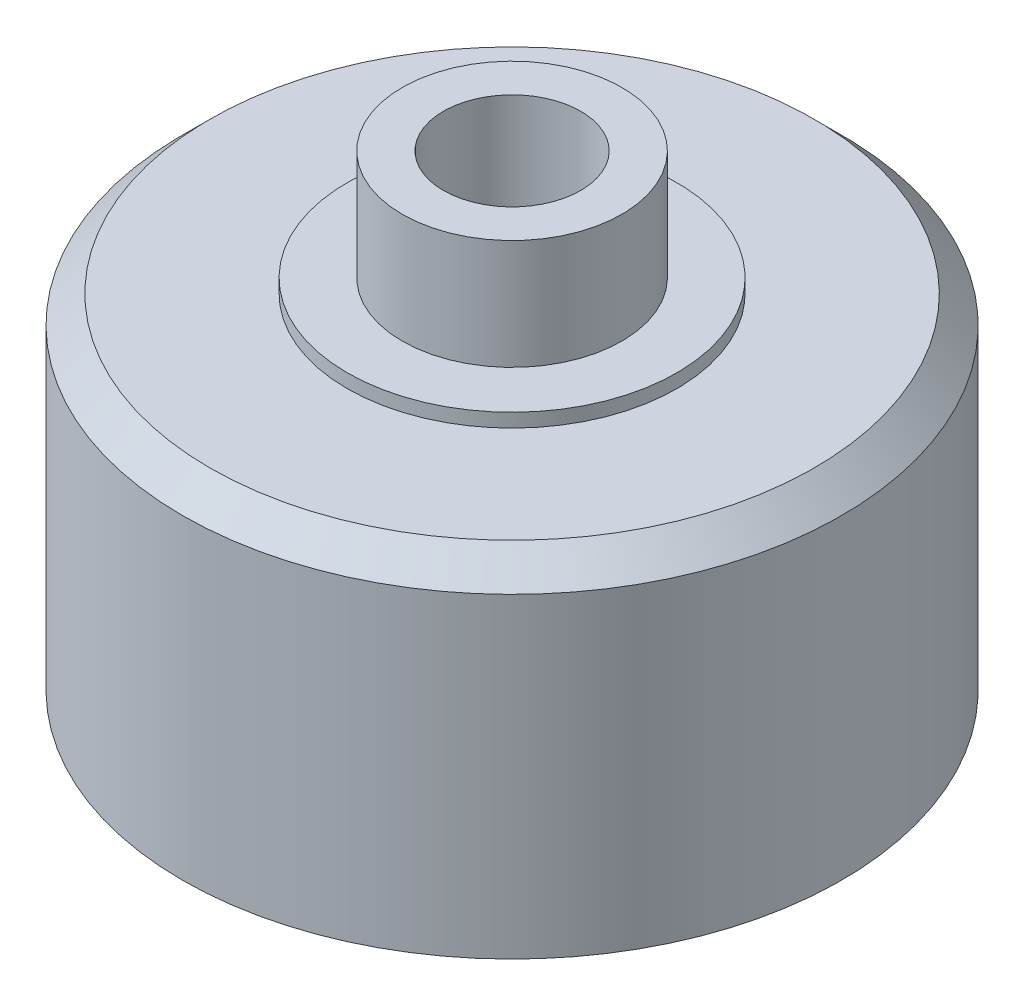
ISO-10303-21;
HEADER;
FILE_DESCRIPTION(('STEP AP214'),'2;1');
FILE_NAME('part.step','',(''),(''),'','','');
FILE_SCHEMA(('AUTOMOTIVE_DESIGN { 1 0 10303 214 1 1 1 1 }'));
ENDSEC;
DATA;
#1=APPLICATION_CONTEXT('core data for automotive mechanical design processes');
#2=APPLICATION_PROTOCOL_DEFINITION('international standard','automotive_design',2000,#1);
#3=PRODUCT_CONTEXT('',#1,'mechanical');
#4=PRODUCT('Part','Part','',(#3));
#5=PRODUCT_RELATED_PRODUCT_CATEGORY('part','',(#4));
#6=PRODUCT_DEFINITION_FORMATION('','',#4);
#7=PRODUCT_DEFINITION_CONTEXT('part definition',#1,'design');
#8=PRODUCT_DEFINITION('design','',#6,#7);
#9=PRODUCT_DEFINITION_SHAPE('','',#8);
#10=(LENGTH_UNIT() NAMED_UNIT(*) SI_UNIT(.MILLI.,.METRE.));
#11=(NAMED_UNIT(*) PLANE_ANGLE_UNIT() SI_UNIT($,.RADIAN.));
#12=(NAMED_UNIT(*) SI_UNIT($,.STERADIAN.) SOLID_ANGLE_UNIT());
#13=UNCERTAINTY_MEASURE_WITH_UNIT(LENGTH_MEASURE(1.E-05),#10,'distance_accuracy_value','');
#14=(GEOMETRIC_REPRESENTATION_CONTEXT(3) GLOBAL_UNCERTAINTY_ASSIGNED_CONTEXT((#13)) GLOBAL_UNIT_ASSIGNED_CONTEXT((#10,
#11,#12)) REPRESENTATION_CONTEXT('',''));
#15=CARTESIAN_POINT('',(0.,0.,0.));
#16=DIRECTION('',(0.,0.,1.));
#17=DIRECTION('',(1.,0.,0.));
#18=AXIS2_PLACEMENT_3D('',#15,#16,#17);
#19=CARTESIAN_POINT('',(0.,12.5,0.));
#20=DIRECTION('',(0.,-1.,0.));
#21=DIRECTION('',(0.,0.,-1.));
#22=AXIS2_PLACEMENT_3D('',#19,#20,#21);
#23=CYLINDRICAL_SURFACE('',#22,10.5);
#24=DIRECTION('',(0.,-1.,0.));
#25=VECTOR('',#24,1.);
#26=CARTESIAN_POINT('',(-7.24030204420042,5.5,-7.60447409810483));
#27=LINE('',#26,#25);
#28=CARTESIAN_POINT('',(-7.24030204420042,0.,-7.60447409810483));
#29=VERTEX_POINT('',#28);
#30=CARTESIAN_POINT('',(-7.24030204420042,11.,-7.60447409810483));
#31=VERTEX_POINT('',#30);
#32=EDGE_CURVE('E53',#29,#31,#27,.F.);
#33=ORIENTED_EDGE('',*,*,#32,.F.);
#34=CARTESIAN_POINT('',(0.,0.,0.));
#35=DIRECTION('',(0.,1.,0.));
#36=DIRECTION('',(0.,0.,1.));
#37=AXIS2_PLACEMENT_3D('',#34,#35,#36);
#38=CIRCLE('',#37,10.5);
#39=CARTESIAN_POINT('',(-2.5,0.,-10.1980390271856));
#40=VERTEX_POINT('',#39);
#41=EDGE_CURVE('E212',#40,#29,#38,.T.);
#42=ORIENTED_EDGE('',*,*,#41,.F.);
#43=DIRECTION('',(0.,-1.,0.));
#44=VECTOR('',#43,1.);
#45=CARTESIAN_POINT('',(-2.5,13.2360679774998,-10.1980390271856));
#46=LINE('',#45,#44);
#47=CARTESIAN_POINT('',(-2.5,11.,-10.1980390271856));
#48=VERTEX_POINT('',#47);
#49=EDGE_CURVE('E272',#48,#40,#46,.T.);
#50=ORIENTED_EDGE('',*,*,#49,.F.);
#51=CARTESIAN_POINT('',(0.,11.,0.));
#52=DIRECTION('',(0.,1.,0.));
#53=DIRECTION('',(0.,0.,1.));
#54=AXIS2_PLACEMENT_3D('',#51,#52,#53);
#55=CIRCLE('',#54,10.5);
#56=EDGE_CURVE('E214',#48,#31,#55,.T.);
#57=ORIENTED_EDGE('',*,*,#56,.T.);
#58=EDGE_LOOP('',(#33,#42,#50,#57));
#59=FACE_BOUND('',#58,.T.);
#60=ADVANCED_FACE('F38',(#59),#23,.F.);
#61=CARTESIAN_POINT('',(9.0913306088608,11.,5.25335204991924));
#62=VERTEX_POINT('',#61);
#63=CARTESIAN_POINT('',(9.0913306088608,11.,-5.25335204991924));
#64=VERTEX_POINT('',#63);
#65=EDGE_CURVE('E432',#62,#64,#55,.T.);
#66=ORIENTED_EDGE('',*,*,#65,.T.);
#67=DIRECTION('',(0.,-1.,0.));
#68=VECTOR('',#67,1.);
#69=CARTESIAN_POINT('',(9.0913306088608,5.5,-5.25335204991924));
#70=LINE('',#69,#68);
#71=CARTESIAN_POINT('',(9.0913306088608,0.,-5.25335204991924));
#72=VERTEX_POINT('',#71);
#73=EDGE_CURVE('E499',#64,#72,#70,.T.);
#74=ORIENTED_EDGE('',*,*,#73,.T.);
#75=CARTESIAN_POINT('',(9.0913306088608,0.,5.25335204991924));
#76=VERTEX_POINT('',#75);
#77=EDGE_CURVE('E233',#76,#72,#38,.T.);
#78=ORIENTED_EDGE('',*,*,#77,.F.);
#79=DIRECTION('',(0.,-1.,0.));
#80=VECTOR('',#79,1.);
#81=CARTESIAN_POINT('',(9.0913306088608,5.5,5.25335204991924));
#82=LINE('',#81,#80);
#83=EDGE_CURVE('E510',#62,#76,#82,.T.);
#84=ORIENTED_EDGE('',*,*,#83,.F.);
#85=EDGE_LOOP('',(#66,#74,#78,#84));
#86=FACE_BOUND('',#85,.T.);
#87=ADVANCED_FACE('F375',(#86),#23,.F.);
#88=CARTESIAN_POINT('',(7.24030204420042,0.,-7.60447409810483));
#89=VERTEX_POINT('',#88);
#90=CARTESIAN_POINT('',(2.5,0.,-10.1980390271856));
#91=VERTEX_POINT('',#90);
#92=EDGE_CURVE('E227',#89,#91,#38,.T.);
#93=ORIENTED_EDGE('',*,*,#92,.F.);
#94=DIRECTION('',(0.,-1.,0.));
#95=VECTOR('',#94,1.);
#96=CARTESIAN_POINT('',(7.24030204420042,5.5,-7.60447409810483));
#97=LINE('',#96,#95);
#98=CARTESIAN_POINT('',(7.24030204420042,11.,-7.60447409810483));
#99=VERTEX_POINT('',#98);
#100=EDGE_CURVE('E497',#89,#99,#97,.F.);
#101=ORIENTED_EDGE('',*,*,#100,.T.);
#102=CARTESIAN_POINT('',(2.5,11.,-10.1980390271856));
#103=VERTEX_POINT('',#102);
#104=EDGE_CURVE('E264',#99,#103,#55,.T.);
#105=ORIENTED_EDGE('',*,*,#104,.T.);
#106=DIRECTION('',(0.,-1.,0.));
#107=VECTOR('',#106,1.);
#108=CARTESIAN_POINT('',(2.5,13.2360679774998,-10.1980390271856));
#109=LINE('',#108,#107);
#110=EDGE_CURVE('E257',#103,#91,#109,.T.);
#111=ORIENTED_EDGE('',*,*,#110,.T.);
#112=EDGE_LOOP('',(#93,#101,#105,#111));
#113=FACE_BOUND('',#112,.T.);
#114=ADVANCED_FACE('F263',(#113),#23,.F.);
#115=DIRECTION('',(0.,-1.,0.));
#116=VECTOR('',#115,1.);
#117=CARTESIAN_POINT('',(7.24030204420042,5.5,7.60447409810483));
#118=LINE('',#117,#116);
#119=CARTESIAN_POINT('',(7.24030204420042,0.,7.60447409810483));
#120=VERTEX_POINT('',#119);
#121=CARTESIAN_POINT('',(7.24030204420042,11.,7.60447409810483));
#122=VERTEX_POINT('',#121);
#123=EDGE_CURVE('E472',#120,#122,#118,.F.);
#124=ORIENTED_EDGE('',*,*,#123,.F.);
#125=CARTESIAN_POINT('',(2.5,0.,10.1980390271856));
#126=VERTEX_POINT('',#125);
#127=EDGE_CURVE('E228',#126,#120,#38,.T.);
#128=ORIENTED_EDGE('',*,*,#127,.F.);
#129=DIRECTION('',(0.,-1.,0.));
#130=VECTOR('',#129,1.);
#131=CARTESIAN_POINT('',(2.5,13.2360679774998,10.1980390271856));
#132=LINE('',#131,#130);
#133=CARTESIAN_POINT('',(2.5,11.,10.1980390271856));
#134=VERTEX_POINT('',#133);
#135=EDGE_CURVE('E292',#134,#126,#132,.T.);
#136=ORIENTED_EDGE('',*,*,#135,.F.);
#137=EDGE_CURVE('E340',#134,#122,#55,.T.);
#138=ORIENTED_EDGE('',*,*,#137,.T.);
#139=EDGE_LOOP('',(#124,#128,#136,#138));
#140=FACE_BOUND('',#139,.T.);
#141=ADVANCED_FACE('F386',(#140),#23,.F.);
#142=DIRECTION('',(0.,-1.,0.));
#143=VECTOR('',#142,1.);
#144=CARTESIAN_POINT('',(-9.0913306088608,5.5,-5.25335204991924));
#145=LINE('',#144,#143);
#146=CARTESIAN_POINT('',(-9.0913306088608,11.,-5.25335204991924));
#147=VERTEX_POINT('',#146);
#148=CARTESIAN_POINT('',(-9.0913306088608,0.,-5.25335204991924));
#149=VERTEX_POINT('',#148);
#150=EDGE_CURVE('E201',#147,#149,#145,.T.);
#151=ORIENTED_EDGE('',*,*,#150,.F.);
#152=CARTESIAN_POINT('',(-9.0913306088608,11.,5.25335204991924));
#153=VERTEX_POINT('',#152);
#154=EDGE_CURVE('E341',#147,#153,#55,.T.);
#155=ORIENTED_EDGE('',*,*,#154,.T.);
#156=DIRECTION('',(0.,-1.,0.));
#157=VECTOR('',#156,1.);
#158=CARTESIAN_POINT('',(-9.0913306088608,5.5,5.25335204991924));
#159=LINE('',#158,#157);
#160=CARTESIAN_POINT('',(-9.0913306088608,0.,5.25335204991924));
#161=VERTEX_POINT('',#160);
#162=EDGE_CURVE('E466',#153,#161,#159,.T.);
#163=ORIENTED_EDGE('',*,*,#162,.T.);
#164=EDGE_CURVE('E223',#149,#161,#38,.T.);
#165=ORIENTED_EDGE('',*,*,#164,.F.);
#166=EDGE_LOOP('',(#151,#155,#163,#165));
#167=FACE_BOUND('',#166,.T.);
#168=ADVANCED_FACE('F377',(#167),#23,.F.);
#169=CARTESIAN_POINT('',(-7.24030204420042,0.,7.60447409810483));
#170=VERTEX_POINT('',#169);
#171=CARTESIAN_POINT('',(-2.5,0.,10.1980390271856));
#172=VERTEX_POINT('',#171);
#173=EDGE_CURVE('E225',#170,#172,#38,.T.);
#174=ORIENTED_EDGE('',*,*,#173,.F.);
#175=DIRECTION('',(0.,-1.,0.));
#176=VECTOR('',#175,1.);
#177=CARTESIAN_POINT('',(-7.24030204420042,5.5,7.60447409810483));
#178=LINE('',#177,#176);
#179=CARTESIAN_POINT('',(-7.24030204420042,11.,7.60447409810483));
#180=VERTEX_POINT('',#179);
#181=EDGE_CURVE('E463',#170,#180,#178,.F.);
#182=ORIENTED_EDGE('',*,*,#181,.T.);
#183=CARTESIAN_POINT('',(-2.5,11.,10.1980390271856));
#184=VERTEX_POINT('',#183);
#185=EDGE_CURVE('E433',#180,#184,#55,.T.);
#186=ORIENTED_EDGE('',*,*,#185,.T.);
#187=DIRECTION('',(0.,-1.,0.));
#188=VECTOR('',#187,1.);
#189=CARTESIAN_POINT('',(-2.5,13.2360679774998,10.1980390271856));
#190=LINE('',#189,#188);
#191=EDGE_CURVE('E304',#184,#172,#190,.T.);
#192=ORIENTED_EDGE('',*,*,#191,.T.);
#193=EDGE_LOOP('',(#174,#182,#186,#192));
#194=FACE_BOUND('',#193,.T.);
#195=ADVANCED_FACE('F385',(#194),#23,.F.);
#196=DIRECTION('',(0.,-1.,0.));
#197=VECTOR('',#196,1.);
#198=CARTESIAN_POINT('',(-1.5,13.2360679774998,-10.3923048454133));
#199=LINE('',#198,#197);
#200=CARTESIAN_POINT('',(-1.5,11.,-10.3923048454133));
#201=VERTEX_POINT('',#200);
#202=CARTESIAN_POINT('',(-1.5,0.,-10.3923048454133));
#203=VERTEX_POINT('',#202);
#204=EDGE_CURVE('E266',#201,#203,#199,.T.);
#205=ORIENTED_EDGE('',*,*,#204,.T.);
#206=CARTESIAN_POINT('',(1.5,0.,-10.3923048454133));
#207=VERTEX_POINT('',#206);
#208=EDGE_CURVE('E222',#207,#203,#38,.T.);
#209=ORIENTED_EDGE('',*,*,#208,.F.);
#210=DIRECTION('',(0.,-1.,0.));
#211=VECTOR('',#210,1.);
#212=CARTESIAN_POINT('',(1.5,13.2360679774998,-10.3923048454133));
#213=LINE('',#212,#211);
#214=CARTESIAN_POINT('',(1.5,11.,-10.3923048454133));
#215=VERTEX_POINT('',#214);
#216=EDGE_CURVE('E265',#215,#207,#213,.T.);
#217=ORIENTED_EDGE('',*,*,#216,.F.);
#218=EDGE_CURVE('E413',#215,#201,#55,.T.);
#219=ORIENTED_EDGE('',*,*,#218,.T.);
#220=EDGE_LOOP('',(#205,#209,#217,#219));
#221=FACE_BOUND('',#220,.T.);
#222=ADVANCED_FACE('F393',(#221),#23,.F.);
#223=CARTESIAN_POINT('',(0.,11.,0.));
#224=DIRECTION('',(0.,1.,0.));
#225=DIRECTION('',(0.,0.,1.));
#226=AXIS2_PLACEMENT_3D('',#223,#224,#225);
#227=PLANE('',#226);
#228=ORIENTED_EDGE('',*,*,#154,.F.);
#229=CARTESIAN_POINT('',(-8.25,11.,-6.49519052838329));
#230=DIRECTION('',(0.,1.,0.));
#231=DIRECTION('',(0.,0.,1.));
#232=AXIS2_PLACEMENT_3D('',#229,#230,#231);
#233=CIRCLE('',#232,1.5);
#234=EDGE_CURVE('E205',#31,#147,#233,.F.);
#235=ORIENTED_EDGE('',*,*,#234,.F.);
#236=ORIENTED_EDGE('',*,*,#56,.F.);
#237=DIRECTION('',(0.,0.,-1.));
#238=VECTOR('',#237,1.);
#239=CARTESIAN_POINT('',(-2.5,11.,-10.1980390271856));
#240=LINE('',#239,#238);
#241=CARTESIAN_POINT('',(-2.5,11.,-8.39230484541327));
#242=VERTEX_POINT('',#241);
#243=EDGE_CURVE('E483',#242,#48,#240,.T.);
#244=ORIENTED_EDGE('',*,*,#243,.F.);
#245=DIRECTION('',(-1.,0.,0.));
#246=VECTOR('',#245,1.);
#247=CARTESIAN_POINT('',(-2.5,11.,-8.39230484541327));
#248=LINE('',#247,#246);
#249=CARTESIAN_POINT('',(-1.5,11.,-8.39230484541327));
#250=VERTEX_POINT('',#249);
#251=EDGE_CURVE('E486',#250,#242,#248,.T.);
#252=ORIENTED_EDGE('',*,*,#251,.F.);
#253=DIRECTION('',(0.,0.,1.));
#254=VECTOR('',#253,1.);
#255=CARTESIAN_POINT('',(-1.5,11.,-8.39230484541327));
#256=LINE('',#255,#254);
#257=EDGE_CURVE('E431',#201,#250,#256,.T.);
#258=ORIENTED_EDGE('',*,*,#257,.F.);
#259=ORIENTED_EDGE('',*,*,#218,.F.);
#260=DIRECTION('',(0.,0.,1.));
#261=VECTOR('',#260,1.);
#262=CARTESIAN_POINT('',(1.5,11.,-8.39230484541327));
#263=LINE('',#262,#261);
#264=CARTESIAN_POINT('',(1.5,11.,-8.39230484541327));
#265=VERTEX_POINT('',#264);
#266=EDGE_CURVE('E427',#215,#265,#263,.T.);
#267=ORIENTED_EDGE('',*,*,#266,.T.);
#268=DIRECTION('',(1.,0.,0.));
#269=VECTOR('',#268,1.);
#270=CARTESIAN_POINT('',(2.5,11.,-8.39230484541327));
#271=LINE('',#270,#269);
#272=CARTESIAN_POINT('',(2.5,11.,-8.39230484541327));
#273=VERTEX_POINT('',#272);
#274=EDGE_CURVE('E281',#265,#273,#271,.T.);
#275=ORIENTED_EDGE('',*,*,#274,.T.);
#276=DIRECTION('',(0.,0.,-1.));
#277=VECTOR('',#276,1.);
#278=CARTESIAN_POINT('',(2.5,11.,-10.1980390271856));
#279=LINE('',#278,#277);
#280=EDGE_CURVE('E261',#273,#103,#279,.T.);
#281=ORIENTED_EDGE('',*,*,#280,.T.);
#282=ORIENTED_EDGE('',*,*,#104,.F.);
#283=CARTESIAN_POINT('',(8.25,11.,-6.49519052838329));
#284=DIRECTION('',(0.,1.,0.));
#285=DIRECTION('',(0.,0.,1.));
#286=AXIS2_PLACEMENT_3D('',#283,#284,#285);
#287=CIRCLE('',#286,1.5);
#288=EDGE_CURVE('E61',#99,#64,#287,.T.);
#289=ORIENTED_EDGE('',*,*,#288,.T.);
#290=ORIENTED_EDGE('',*,*,#65,.F.);
#291=CARTESIAN_POINT('',(8.25,11.,6.49519052838329));
#292=DIRECTION('',(0.,1.,0.));
#293=DIRECTION('',(0.,0.,1.));
#294=AXIS2_PLACEMENT_3D('',#291,#292,#293);
#295=CIRCLE('',#294,1.5);
#296=EDGE_CURVE('E508',#122,#62,#295,.F.);
#297=ORIENTED_EDGE('',*,*,#296,.F.);
#298=ORIENTED_EDGE('',*,*,#137,.F.);
#299=DIRECTION('',(0.,0.,1.));
#300=VECTOR('',#299,1.);
#301=CARTESIAN_POINT('',(2.5,11.,10.1980390271856));
#302=LINE('',#301,#300);
#303=CARTESIAN_POINT('',(2.5,11.,8.39230484541327));
#304=VERTEX_POINT('',#303);
#305=EDGE_CURVE('E290',#304,#134,#302,.T.);
#306=ORIENTED_EDGE('',*,*,#305,.F.);
#307=DIRECTION('',(1.,0.,0.));
#308=VECTOR('',#307,1.);
#309=CARTESIAN_POINT('',(2.5,11.,8.39230484541327));
#310=LINE('',#309,#308);
#311=CARTESIAN_POINT('',(1.5,11.,8.39230484541327));
#312=VERTEX_POINT('',#311);
#313=EDGE_CURVE('E294',#312,#304,#310,.T.);
#314=ORIENTED_EDGE('',*,*,#313,.F.);
#315=DIRECTION('',(0.,0.,-1.));
#316=VECTOR('',#315,1.);
#317=CARTESIAN_POINT('',(1.5,11.,8.39230484541327));
#318=LINE('',#317,#316);
#319=CARTESIAN_POINT('',(1.5,11.,10.3923048454133));
#320=VERTEX_POINT('',#319);
#321=EDGE_CURVE('E286',#320,#312,#318,.T.);
#322=ORIENTED_EDGE('',*,*,#321,.F.);
#323=CARTESIAN_POINT('',(-1.5,11.,10.3923048454133));
#324=VERTEX_POINT('',#323);
#325=EDGE_CURVE('E337',#324,#320,#55,.T.);
#326=ORIENTED_EDGE('',*,*,#325,.F.);
#327=DIRECTION('',(0.,0.,-1.));
#328=VECTOR('',#327,1.);
#329=CARTESIAN_POINT('',(-1.5,11.,8.39230484541327));
#330=LINE('',#329,#328);
#331=CARTESIAN_POINT('',(-1.5,11.,8.39230484541327));
#332=VERTEX_POINT('',#331);
#333=EDGE_CURVE('E321',#324,#332,#330,.T.);
#334=ORIENTED_EDGE('',*,*,#333,.T.);
#335=DIRECTION('',(-1.,0.,0.));
#336=VECTOR('',#335,1.);
#337=CARTESIAN_POINT('',(-2.5,11.,8.39230484541327));
#338=LINE('',#337,#336);
#339=CARTESIAN_POINT('',(-2.5,11.,8.39230484541327));
#340=VERTEX_POINT('',#339);
#341=EDGE_CURVE('E318',#332,#340,#338,.T.);
#342=ORIENTED_EDGE('',*,*,#341,.T.);
#343=DIRECTION('',(0.,0.,1.));
#344=VECTOR('',#343,1.);
#345=CARTESIAN_POINT('',(-2.5,11.,10.1980390271856));
#346=LINE('',#345,#344);
#347=EDGE_CURVE('E308',#340,#184,#346,.T.);
#348=ORIENTED_EDGE('',*,*,#347,.T.);
#349=ORIENTED_EDGE('',*,*,#185,.F.);
#350=CARTESIAN_POINT('',(-8.25,11.,6.49519052838329));
#351=DIRECTION('',(0.,1.,0.));
#352=DIRECTION('',(0.,0.,1.));
#353=AXIS2_PLACEMENT_3D('',#350,#351,#352);
#354=CIRCLE('',#353,1.5);
#355=EDGE_CURVE('E460',#180,#153,#354,.T.);
#356=ORIENTED_EDGE('',*,*,#355,.T.);
#357=EDGE_LOOP('',(#228,#235,#236,#244,#252,#258,#259,#267,#275,#281,#282,#289,#290,#297,#298,
#306,#314,#322,#326,#334,#342,#348,#349,#356));
#358=FACE_BOUND('',#357,.T.);
#359=CARTESIAN_POINT('',(0.,11.,0.));
#360=DIRECTION('',(0.,1.,0.));
#361=DIRECTION('',(0.,0.,1.));
#362=AXIS2_PLACEMENT_3D('',#359,#360,#361);
#363=CIRCLE('',#362,2.5);
#364=CARTESIAN_POINT('',(0.,11.,2.5));
#365=VERTEX_POINT('',#364);
#366=EDGE_CURVE('E339',#365,#365,#363,.T.);
#367=ORIENTED_EDGE('',*,*,#366,.T.);
#368=EDGE_LOOP('',(#367));
#369=FACE_BOUND('',#368,.T.);
#370=ADVANCED_FACE('F397',(#358,#369),#227,.F.);
#371=DIRECTION('',(0.,-1.,0.));
#372=VECTOR('',#371,1.);
#373=CARTESIAN_POINT('',(1.5,13.2360679774998,10.3923048454133));
#374=LINE('',#373,#372);
#375=CARTESIAN_POINT('',(1.5,0.,10.3923048454133));
#376=VERTEX_POINT('',#375);
#377=EDGE_CURVE('E299',#320,#376,#374,.T.);
#378=ORIENTED_EDGE('',*,*,#377,.T.);
#379=CARTESIAN_POINT('',(-1.5,0.,10.3923048454133));
#380=VERTEX_POINT('',#379);
#381=EDGE_CURVE('E229',#380,#376,#38,.T.);
#382=ORIENTED_EDGE('',*,*,#381,.F.);
#383=DIRECTION('',(0.,-1.,0.));
#384=VECTOR('',#383,1.);
#385=CARTESIAN_POINT('',(-1.5,13.2360679774998,10.3923048454133));
#386=LINE('',#385,#384);
#387=EDGE_CURVE('E317',#324,#380,#386,.T.);
#388=ORIENTED_EDGE('',*,*,#387,.F.);
#389=ORIENTED_EDGE('',*,*,#325,.T.);
#390=EDGE_LOOP('',(#378,#382,#388,#389));
#391=FACE_BOUND('',#390,.T.);
#392=ADVANCED_FACE('F388',(#391),#23,.F.);
#393=CARTESIAN_POINT('',(0.,12.5,0.));
#394=DIRECTION('',(0.,1.,0.));
#395=DIRECTION('',(0.,0.,1.));
#396=AXIS2_PLACEMENT_3D('',#393,#394,#395);
#397=PLANE('',#396);
#398=CARTESIAN_POINT('',(0.,12.5,0.));
#399=DIRECTION('',(0.,1.,0.));
#400=DIRECTION('',(0.,0.,1.));
#401=AXIS2_PLACEMENT_3D('',#398,#399,#400);
#402=CIRCLE('',#401,11.);
#403=CARTESIAN_POINT('',(0.,12.5,11.));
#404=VERTEX_POINT('',#403);
#405=EDGE_CURVE('E46',#404,#404,#402,.T.);
#406=ORIENTED_EDGE('',*,*,#405,.T.);
#407=EDGE_LOOP('',(#406));
#408=FACE_BOUND('',#407,.T.);
#409=CARTESIAN_POINT('',(0.,12.5,0.));
#410=DIRECTION('',(0.,1.,0.));
#411=DIRECTION('',(0.,0.,1.));
#412=AXIS2_PLACEMENT_3D('',#409,#410,#411);
#413=CIRCLE('',#412,6.);
#414=CARTESIAN_POINT('',(0.,12.5,6.));
#415=VERTEX_POINT('',#414);
#416=EDGE_CURVE('E332',#415,#415,#413,.T.);
#417=ORIENTED_EDGE('',*,*,#416,.F.);
#418=EDGE_LOOP('',(#417));
#419=FACE_BOUND('',#418,.T.);
#420=ADVANCED_FACE('F356',(#408,#419),#397,.T.);
#421=CARTESIAN_POINT('',(0.,12.5,0.));
#422=DIRECTION('',(0.,-1.,0.));
#423=DIRECTION('',(0.,0.,-1.));
#424=AXIS2_PLACEMENT_3D('',#421,#422,#423);
#425=CYLINDRICAL_SURFACE('',#424,12.);
#426=CARTESIAN_POINT('',(0.,0.,0.));
#427=DIRECTION('',(0.,1.,0.));
#428=DIRECTION('',(0.,0.,1.));
#429=AXIS2_PLACEMENT_3D('',#426,#427,#428);
#430=CIRCLE('',#429,12.);
#431=CARTESIAN_POINT('',(0.,0.,12.));
#432=VERTEX_POINT('',#431);
#433=EDGE_CURVE('E347',#432,#432,#430,.T.);
#434=ORIENTED_EDGE('',*,*,#433,.T.);
#435=EDGE_LOOP('',(#434));
#436=FACE_BOUND('',#435,.T.);
#437=CARTESIAN_POINT('',(0.,11.5,0.));
#438=DIRECTION('',(0.,1.,0.));
#439=DIRECTION('',(0.,0.,1.));
#440=AXIS2_PLACEMENT_3D('',#437,#438,#439);
#441=CIRCLE('',#440,12.);
#442=CARTESIAN_POINT('',(0.,11.5,12.));
#443=VERTEX_POINT('',#442);
#444=EDGE_CURVE('E11',#443,#443,#441,.F.);
#445=ORIENTED_EDGE('',*,*,#444,.T.);
#446=EDGE_LOOP('',(#445));
#447=FACE_BOUND('',#446,.T.);
#448=ADVANCED_FACE('F403',(#436,#447),#425,.T.);
#449=CARTESIAN_POINT('',(0.,0.,0.));
#450=DIRECTION('',(0.,1.,0.));
#451=DIRECTION('',(0.,0.,1.));
#452=AXIS2_PLACEMENT_3D('',#449,#450,#451);
#453=PLANE('',#452);
#454=CARTESIAN_POINT('',(-8.25,0.,-6.49519052838329));
#455=DIRECTION('',(0.,-1.,0.));
#456=DIRECTION('',(0.,0.,-1.));
#457=AXIS2_PLACEMENT_3D('',#454,#455,#456);
#458=CIRCLE('',#457,0.75);
#459=CARTESIAN_POINT('',(-8.25,0.,-7.24519052838329));
#460=VERTEX_POINT('',#459);
#461=EDGE_CURVE('E908',#460,#460,#458,.T.);
#462=ORIENTED_EDGE('',*,*,#461,.F.);
#463=EDGE_LOOP('',(#462));
#464=FACE_BOUND('',#463,.T.);
#465=CARTESIAN_POINT('',(8.25,0.,-6.49519052838329));
#466=DIRECTION('',(0.,1.,0.));
#467=DIRECTION('',(0.,0.,-1.));
#468=AXIS2_PLACEMENT_3D('',#465,#466,#467);
#469=CIRCLE('',#468,0.75);
#470=CARTESIAN_POINT('',(8.25,0.,-7.24519052838329));
#471=VERTEX_POINT('',#470);
#472=EDGE_CURVE('E902',#471,#471,#469,.T.);
#473=ORIENTED_EDGE('',*,*,#472,.T.);
#474=EDGE_LOOP('',(#473));
#475=FACE_BOUND('',#474,.T.);
#476=CARTESIAN_POINT('',(8.25,0.,6.49519052838329));
#477=DIRECTION('',(0.,-1.,0.));
#478=DIRECTION('',(0.,0.,1.));
#479=AXIS2_PLACEMENT_3D('',#476,#477,#478);
#480=CIRCLE('',#479,0.75);
#481=CARTESIAN_POINT('',(8.25,0.,7.24519052838329));
#482=VERTEX_POINT('',#481);
#483=EDGE_CURVE('E896',#482,#482,#480,.T.);
#484=ORIENTED_EDGE('',*,*,#483,.F.);
#485=EDGE_LOOP('',(#484));
#486=FACE_BOUND('',#485,.T.);
#487=CARTESIAN_POINT('',(-8.25,0.,6.49519052838329));
#488=DIRECTION('',(0.,1.,0.));
#489=DIRECTION('',(0.,0.,1.));
#490=AXIS2_PLACEMENT_3D('',#487,#488,#489);
#491=CIRCLE('',#490,0.75);
#492=CARTESIAN_POINT('',(-8.25,0.,7.24519052838329));
#493=VERTEX_POINT('',#492);
#494=EDGE_CURVE('E890',#493,#493,#491,.T.);
#495=ORIENTED_EDGE('',*,*,#494,.T.);
#496=EDGE_LOOP('',(#495));
#497=FACE_BOUND('',#496,.T.);
#498=ORIENTED_EDGE('',*,*,#433,.F.);
#499=EDGE_LOOP('',(#498));
#500=FACE_BOUND('',#499,.T.);
#501=ORIENTED_EDGE('',*,*,#41,.T.);
#502=CARTESIAN_POINT('',(-8.25,0.,-6.49519052838329));
#503=DIRECTION('',(0.,-1.,0.));
#504=DIRECTION('',(0.,0.,-1.));
#505=AXIS2_PLACEMENT_3D('',#502,#503,#504);
#506=CIRCLE('',#505,1.5);
#507=EDGE_CURVE('E198',#29,#149,#506,.T.);
#508=ORIENTED_EDGE('',*,*,#507,.T.);
#509=ORIENTED_EDGE('',*,*,#164,.T.);
#510=CARTESIAN_POINT('',(-8.25,0.,6.49519052838329));
#511=DIRECTION('',(0.,1.,0.));
#512=DIRECTION('',(0.,0.,1.));
#513=AXIS2_PLACEMENT_3D('',#510,#511,#512);
#514=CIRCLE('',#513,1.5);
#515=EDGE_CURVE('E470',#170,#161,#514,.T.);
#516=ORIENTED_EDGE('',*,*,#515,.F.);
#517=ORIENTED_EDGE('',*,*,#173,.T.);
#518=DIRECTION('',(0.,0.,1.));
#519=VECTOR('',#518,1.);
#520=CARTESIAN_POINT('',(-2.5,0.,10.1980390271856));
#521=LINE('',#520,#519);
#522=CARTESIAN_POINT('',(-2.5,0.,8.39230484541327));
#523=VERTEX_POINT('',#522);
#524=EDGE_CURVE('E305',#523,#172,#521,.T.);
#525=ORIENTED_EDGE('',*,*,#524,.F.);
#526=DIRECTION('',(-1.,0.,0.));
#527=VECTOR('',#526,1.);
#528=CARTESIAN_POINT('',(-2.5,0.,8.39230484541327));
#529=LINE('',#528,#527);
#530=CARTESIAN_POINT('',(-1.5,0.,8.39230484541327));
#531=VERTEX_POINT('',#530);
#532=EDGE_CURVE('E310',#531,#523,#529,.T.);
#533=ORIENTED_EDGE('',*,*,#532,.F.);
#534=DIRECTION('',(0.,0.,-1.));
#535=VECTOR('',#534,1.);
#536=CARTESIAN_POINT('',(-1.5,0.,8.39230484541327));
#537=LINE('',#536,#535);
#538=EDGE_CURVE('E314',#380,#531,#537,.T.);
#539=ORIENTED_EDGE('',*,*,#538,.F.);
#540=ORIENTED_EDGE('',*,*,#381,.T.);
#541=DIRECTION('',(0.,0.,-1.));
#542=VECTOR('',#541,1.);
#543=CARTESIAN_POINT('',(1.5,0.,8.39230484541327));
#544=LINE('',#543,#542);
#545=CARTESIAN_POINT('',(1.5,0.,8.39230484541327));
#546=VERTEX_POINT('',#545);
#547=EDGE_CURVE('E277',#376,#546,#544,.T.);
#548=ORIENTED_EDGE('',*,*,#547,.T.);
#549=DIRECTION('',(1.,0.,0.));
#550=VECTOR('',#549,1.);
#551=CARTESIAN_POINT('',(2.5,0.,8.39230484541327));
#552=LINE('',#551,#550);
#553=CARTESIAN_POINT('',(2.5,0.,8.39230484541327));
#554=VERTEX_POINT('',#553);
#555=EDGE_CURVE('E280',#546,#554,#552,.T.);
#556=ORIENTED_EDGE('',*,*,#555,.T.);
#557=DIRECTION('',(0.,0.,1.));
#558=VECTOR('',#557,1.);
#559=CARTESIAN_POINT('',(2.5,0.,10.1980390271856));
#560=LINE('',#559,#558);
#561=EDGE_CURVE('E284',#554,#126,#560,.T.);
#562=ORIENTED_EDGE('',*,*,#561,.T.);
#563=ORIENTED_EDGE('',*,*,#127,.T.);
#564=CARTESIAN_POINT('',(8.25,0.,6.49519052838329));
#565=DIRECTION('',(0.,-1.,0.));
#566=DIRECTION('',(0.,0.,1.));
#567=AXIS2_PLACEMENT_3D('',#564,#565,#566);
#568=CIRCLE('',#567,1.5);
#569=EDGE_CURVE('E506',#120,#76,#568,.T.);
#570=ORIENTED_EDGE('',*,*,#569,.T.);
#571=ORIENTED_EDGE('',*,*,#77,.T.);
#572=CARTESIAN_POINT('',(8.25,0.,-6.49519052838329));
#573=DIRECTION('',(0.,1.,0.));
#574=DIRECTION('',(0.,0.,-1.));
#575=AXIS2_PLACEMENT_3D('',#572,#573,#574);
#576=CIRCLE('',#575,1.5);
#577=EDGE_CURVE('E215',#89,#72,#576,.T.);
#578=ORIENTED_EDGE('',*,*,#577,.F.);
#579=ORIENTED_EDGE('',*,*,#92,.T.);
#580=DIRECTION('',(0.,0.,-1.));
#581=VECTOR('',#580,1.);
#582=CARTESIAN_POINT('',(2.5,0.,-10.1980390271856));
#583=LINE('',#582,#581);
#584=CARTESIAN_POINT('',(2.5,0.,-8.39230484541327));
#585=VERTEX_POINT('',#584);
#586=EDGE_CURVE('E248',#585,#91,#583,.T.);
#587=ORIENTED_EDGE('',*,*,#586,.F.);
#588=DIRECTION('',(1.,0.,0.));
#589=VECTOR('',#588,1.);
#590=CARTESIAN_POINT('',(2.5,0.,-8.39230484541327));
#591=LINE('',#590,#589);
#592=CARTESIAN_POINT('',(1.5,0.,-8.39230484541327));
#593=VERTEX_POINT('',#592);
#594=EDGE_CURVE('E420',#593,#585,#591,.T.);
#595=ORIENTED_EDGE('',*,*,#594,.F.);
#596=DIRECTION('',(0.,0.,1.));
#597=VECTOR('',#596,1.);
#598=CARTESIAN_POINT('',(1.5,0.,-8.39230484541327));
#599=LINE('',#598,#597);
#600=EDGE_CURVE('E269',#207,#593,#599,.T.);
#601=ORIENTED_EDGE('',*,*,#600,.F.);
#602=ORIENTED_EDGE('',*,*,#208,.T.);
#603=DIRECTION('',(0.,0.,1.));
#604=VECTOR('',#603,1.);
#605=CARTESIAN_POINT('',(-1.5,0.,-8.39230484541327));
#606=LINE('',#605,#604);
#607=CARTESIAN_POINT('',(-1.5,0.,-8.39230484541327));
#608=VERTEX_POINT('',#607);
#609=EDGE_CURVE('E418',#203,#608,#606,.T.);
#610=ORIENTED_EDGE('',*,*,#609,.T.);
#611=DIRECTION('',(-1.,0.,0.));
#612=VECTOR('',#611,1.);
#613=CARTESIAN_POINT('',(-2.5,0.,-8.39230484541327));
#614=LINE('',#613,#612);
#615=CARTESIAN_POINT('',(-2.5,0.,-8.39230484541327));
#616=VERTEX_POINT('',#615);
#617=EDGE_CURVE('E478',#608,#616,#614,.T.);
#618=ORIENTED_EDGE('',*,*,#617,.T.);
#619=DIRECTION('',(0.,0.,-1.));
#620=VECTOR('',#619,1.);
#621=CARTESIAN_POINT('',(-2.5,0.,-10.1980390271856));
#622=LINE('',#621,#620);
#623=EDGE_CURVE('E220',#616,#40,#622,.T.);
#624=ORIENTED_EDGE('',*,*,#623,.T.);
#625=EDGE_LOOP('',(#501,#508,#509,#516,#517,#525,#533,#539,#540,#548,#556,#562,#563,#570,#571,
#578,#579,#587,#595,#601,#602,#610,#618,#624));
#626=FACE_BOUND('',#625,.T.);
#627=ADVANCED_FACE('F217',(#464,#475,#486,#497,#500,#626),#453,.F.);
#628=CARTESIAN_POINT('',(0.,17.,0.));
#629=DIRECTION('',(0.,-1.,0.));
#630=DIRECTION('',(0.,0.,-1.));
#631=AXIS2_PLACEMENT_3D('',#628,#629,#630);
#632=CYLINDRICAL_SURFACE('',#631,4.);
#633=CARTESIAN_POINT('',(0.,13.,0.));
#634=DIRECTION('',(0.,1.,0.));
#635=DIRECTION('',(0.,0.,1.));
#636=AXIS2_PLACEMENT_3D('',#633,#634,#635);
#637=CIRCLE('',#636,4.);
#638=CARTESIAN_POINT('',(0.,13.,4.));
#639=VERTEX_POINT('',#638);
#640=EDGE_CURVE('E320',#639,#639,#637,.T.);
#641=ORIENTED_EDGE('',*,*,#640,.T.);
#642=EDGE_LOOP('',(#641));
#643=FACE_BOUND('',#642,.T.);
#644=CARTESIAN_POINT('',(0.,17.,0.));
#645=DIRECTION('',(0.,1.,0.));
#646=DIRECTION('',(0.,0.,1.));
#647=AXIS2_PLACEMENT_3D('',#644,#645,#646);
#648=CIRCLE('',#647,4.);
#649=CARTESIAN_POINT('',(0.,17.,4.));
#650=VERTEX_POINT('',#649);
#651=EDGE_CURVE('E343',#650,#650,#648,.T.);
#652=ORIENTED_EDGE('',*,*,#651,.F.);
#653=EDGE_LOOP('',(#652));
#654=FACE_BOUND('',#653,.T.);
#655=ADVANCED_FACE('F548',(#643,#654),#632,.T.);
#656=CARTESIAN_POINT('',(0.,17.,0.));
#657=DIRECTION('',(0.,1.,0.));
#658=DIRECTION('',(0.,0.,1.));
#659=AXIS2_PLACEMENT_3D('',#656,#657,#658);
#660=PLANE('',#659);
#661=CARTESIAN_POINT('',(0.,17.,0.));
#662=DIRECTION('',(0.,1.,0.));
#663=DIRECTION('',(0.,0.,1.));
#664=AXIS2_PLACEMENT_3D('',#661,#662,#663);
#665=CIRCLE('',#664,2.5);
#666=CARTESIAN_POINT('',(0.,17.,2.5));
#667=VERTEX_POINT('',#666);
#668=EDGE_CURVE('E232',#667,#667,#665,.T.);
#669=ORIENTED_EDGE('',*,*,#668,.F.);
#670=EDGE_LOOP('',(#669));
#671=FACE_BOUND('',#670,.T.);
#672=ORIENTED_EDGE('',*,*,#651,.T.);
#673=EDGE_LOOP('',(#672));
#674=FACE_BOUND('',#673,.T.);
#675=ADVANCED_FACE('F370',(#671,#674),#660,.T.);
#676=CARTESIAN_POINT('',(0.,17.,0.));
#677=DIRECTION('',(0.,-1.,0.));
#678=DIRECTION('',(0.,0.,-1.));
#679=AXIS2_PLACEMENT_3D('',#676,#677,#678);
#680=CYLINDRICAL_SURFACE('',#679,2.5);
#681=ORIENTED_EDGE('',*,*,#668,.T.);
#682=EDGE_LOOP('',(#681));
#683=FACE_BOUND('',#682,.T.);
#684=ORIENTED_EDGE('',*,*,#366,.F.);
#685=EDGE_LOOP('',(#684));
#686=FACE_BOUND('',#685,.T.);
#687=ADVANCED_FACE('F361',(#683,#686),#680,.F.);
#688=CARTESIAN_POINT('',(0.,12.5,0.));
#689=DIRECTION('',(0.,-1.,0.));
#690=DIRECTION('',(0.,0.,-1.));
#691=AXIS2_PLACEMENT_3D('',#688,#689,#690);
#692=CONICAL_SURFACE('',#691,11.,0.785398163397446);
#693=ORIENTED_EDGE('',*,*,#444,.F.);
#694=EDGE_LOOP('',(#693));
#695=FACE_BOUND('',#694,.T.);
#696=ORIENTED_EDGE('',*,*,#405,.F.);
#697=EDGE_LOOP('',(#696));
#698=FACE_BOUND('',#697,.T.);
#699=ADVANCED_FACE('F40',(#695,#698),#692,.T.);
#700=CARTESIAN_POINT('',(0.,13.,0.));
#701=DIRECTION('',(0.,1.,0.));
#702=DIRECTION('',(0.,0.,1.));
#703=AXIS2_PLACEMENT_3D('',#700,#701,#702);
#704=PLANE('',#703);
#705=CARTESIAN_POINT('',(0.,13.,0.));
#706=DIRECTION('',(0.,1.,0.));
#707=DIRECTION('',(0.,0.,1.));
#708=AXIS2_PLACEMENT_3D('',#705,#706,#707);
#709=CIRCLE('',#708,6.);
#710=CARTESIAN_POINT('',(0.,13.,6.));
#711=VERTEX_POINT('',#710);
#712=EDGE_CURVE('E238',#711,#711,#709,.T.);
#713=ORIENTED_EDGE('',*,*,#712,.T.);
#714=EDGE_LOOP('',(#713));
#715=FACE_BOUND('',#714,.T.);
#716=ORIENTED_EDGE('',*,*,#640,.F.);
#717=EDGE_LOOP('',(#716));
#718=FACE_BOUND('',#717,.T.);
#719=ADVANCED_FACE('F360',(#715,#718),#704,.T.);
#720=CARTESIAN_POINT('',(0.,13.,0.));
#721=DIRECTION('',(0.,-1.,0.));
#722=DIRECTION('',(0.,0.,-1.));
#723=AXIS2_PLACEMENT_3D('',#720,#721,#722);
#724=CYLINDRICAL_SURFACE('',#723,6.);
#725=ORIENTED_EDGE('',*,*,#712,.F.);
#726=EDGE_LOOP('',(#725));
#727=FACE_BOUND('',#726,.T.);
#728=ORIENTED_EDGE('',*,*,#416,.T.);
#729=EDGE_LOOP('',(#728));
#730=FACE_BOUND('',#729,.T.);
#731=ADVANCED_FACE('F367',(#727,#730),#724,.T.);
#732=CARTESIAN_POINT('',(-1.5,13.2360679774998,8.39230484541327));
#733=DIRECTION('',(-1.,0.,0.));
#734=DIRECTION('',(0.,0.,1.));
#735=AXIS2_PLACEMENT_3D('',#732,#733,#734);
#736=PLANE('',#735);
#737=ORIENTED_EDGE('',*,*,#333,.F.);
#738=ORIENTED_EDGE('',*,*,#387,.T.);
#739=ORIENTED_EDGE('',*,*,#538,.T.);
#740=DIRECTION('',(0.,-1.,0.));
#741=VECTOR('',#740,1.);
#742=CARTESIAN_POINT('',(-1.5,13.2360679774998,8.39230484541327));
#743=LINE('',#742,#741);
#744=EDGE_CURVE('E313',#332,#531,#743,.T.);
#745=ORIENTED_EDGE('',*,*,#744,.F.);
#746=EDGE_LOOP('',(#737,#738,#739,#745));
#747=FACE_BOUND('',#746,.T.);
#748=ADVANCED_FACE('F447',(#747),#736,.F.);
#749=CARTESIAN_POINT('',(-2.5,13.2360679774998,8.39230484541327));
#750=DIRECTION('',(0.,0.,1.));
#751=DIRECTION('',(1.,0.,0.));
#752=AXIS2_PLACEMENT_3D('',#749,#750,#751);
#753=PLANE('',#752);
#754=ORIENTED_EDGE('',*,*,#341,.F.);
#755=ORIENTED_EDGE('',*,*,#744,.T.);
#756=ORIENTED_EDGE('',*,*,#532,.T.);
#757=DIRECTION('',(0.,-1.,0.));
#758=VECTOR('',#757,1.);
#759=CARTESIAN_POINT('',(-2.5,13.2360679774998,8.39230484541327));
#760=LINE('',#759,#758);
#761=EDGE_CURVE('E309',#340,#523,#760,.T.);
#762=ORIENTED_EDGE('',*,*,#761,.F.);
#763=EDGE_LOOP('',(#754,#755,#756,#762));
#764=FACE_BOUND('',#763,.T.);
#765=ADVANCED_FACE('F453',(#764),#753,.F.);
#766=CARTESIAN_POINT('',(-2.5,13.2360679774998,10.1980390271856));
#767=DIRECTION('',(1.,0.,0.));
#768=DIRECTION('',(0.,0.,-1.));
#769=AXIS2_PLACEMENT_3D('',#766,#767,#768);
#770=PLANE('',#769);
#771=ORIENTED_EDGE('',*,*,#347,.F.);
#772=ORIENTED_EDGE('',*,*,#761,.T.);
#773=ORIENTED_EDGE('',*,*,#524,.T.);
#774=ORIENTED_EDGE('',*,*,#191,.F.);
#775=EDGE_LOOP('',(#771,#772,#773,#774));
#776=FACE_BOUND('',#775,.T.);
#777=ADVANCED_FACE('F457',(#776),#770,.F.);
#778=CARTESIAN_POINT('',(1.5,13.2360679774998,8.39230484541327));
#779=DIRECTION('',(-1.,0.,0.));
#780=DIRECTION('',(0.,0.,1.));
#781=AXIS2_PLACEMENT_3D('',#778,#779,#780);
#782=PLANE('',#781);
#783=ORIENTED_EDGE('',*,*,#377,.F.);
#784=ORIENTED_EDGE('',*,*,#321,.T.);
#785=DIRECTION('',(0.,-1.,0.));
#786=VECTOR('',#785,1.);
#787=CARTESIAN_POINT('',(1.5,13.2360679774998,8.39230484541327));
#788=LINE('',#787,#786);
#789=EDGE_CURVE('E289',#312,#546,#788,.T.);
#790=ORIENTED_EDGE('',*,*,#789,.T.);
#791=ORIENTED_EDGE('',*,*,#547,.F.);
#792=EDGE_LOOP('',(#783,#784,#790,#791));
#793=FACE_BOUND('',#792,.T.);
#794=ADVANCED_FACE('F524',(#793),#782,.T.);
#795=CARTESIAN_POINT('',(2.5,13.2360679774998,8.39230484541327));
#796=DIRECTION('',(0.,0.,-1.));
#797=DIRECTION('',(-1.,0.,0.));
#798=AXIS2_PLACEMENT_3D('',#795,#796,#797);
#799=PLANE('',#798);
#800=ORIENTED_EDGE('',*,*,#789,.F.);
#801=ORIENTED_EDGE('',*,*,#313,.T.);
#802=DIRECTION('',(0.,-1.,0.));
#803=VECTOR('',#802,1.);
#804=CARTESIAN_POINT('',(2.5,13.2360679774998,8.39230484541327));
#805=LINE('',#804,#803);
#806=EDGE_CURVE('E293',#304,#554,#805,.T.);
#807=ORIENTED_EDGE('',*,*,#806,.T.);
#808=ORIENTED_EDGE('',*,*,#555,.F.);
#809=EDGE_LOOP('',(#800,#801,#807,#808));
#810=FACE_BOUND('',#809,.T.);
#811=ADVANCED_FACE('F522',(#810),#799,.T.);
#812=CARTESIAN_POINT('',(2.5,13.2360679774998,10.1980390271856));
#813=DIRECTION('',(1.,0.,0.));
#814=DIRECTION('',(0.,0.,-1.));
#815=AXIS2_PLACEMENT_3D('',#812,#813,#814);
#816=PLANE('',#815);
#817=ORIENTED_EDGE('',*,*,#806,.F.);
#818=ORIENTED_EDGE('',*,*,#305,.T.);
#819=ORIENTED_EDGE('',*,*,#135,.T.);
#820=ORIENTED_EDGE('',*,*,#561,.F.);
#821=EDGE_LOOP('',(#817,#818,#819,#820));
#822=FACE_BOUND('',#821,.T.);
#823=ADVANCED_FACE('F518',(#822),#816,.T.);
#824=CARTESIAN_POINT('',(1.5,13.2360679774998,-8.39230484541327));
#825=DIRECTION('',(1.,0.,0.));
#826=DIRECTION('',(0.,0.,-1.));
#827=AXIS2_PLACEMENT_3D('',#824,#825,#826);
#828=PLANE('',#827);
#829=ORIENTED_EDGE('',*,*,#266,.F.);
#830=ORIENTED_EDGE('',*,*,#216,.T.);
#831=ORIENTED_EDGE('',*,*,#600,.T.);
#832=DIRECTION('',(0.,-1.,0.));
#833=VECTOR('',#832,1.);
#834=CARTESIAN_POINT('',(1.5,13.2360679774998,-8.39230484541327));
#835=LINE('',#834,#833);
#836=EDGE_CURVE('E423',#265,#593,#835,.T.);
#837=ORIENTED_EDGE('',*,*,#836,.F.);
#838=EDGE_LOOP('',(#829,#830,#831,#837));
#839=FACE_BOUND('',#838,.T.);
#840=ADVANCED_FACE('F425',(#839),#828,.F.);
#841=CARTESIAN_POINT('',(2.5,13.2360679774998,-8.39230484541327));
#842=DIRECTION('',(0.,0.,-1.));
#843=DIRECTION('',(-1.,0.,0.));
#844=AXIS2_PLACEMENT_3D('',#841,#842,#843);
#845=PLANE('',#844);
#846=ORIENTED_EDGE('',*,*,#274,.F.);
#847=ORIENTED_EDGE('',*,*,#836,.T.);
#848=ORIENTED_EDGE('',*,*,#594,.T.);
#849=DIRECTION('',(0.,-1.,0.));
#850=VECTOR('',#849,1.);
#851=CARTESIAN_POINT('',(2.5,13.2360679774998,-8.39230484541327));
#852=LINE('',#851,#850);
#853=EDGE_CURVE('E259',#273,#585,#852,.T.);
#854=ORIENTED_EDGE('',*,*,#853,.F.);
#855=EDGE_LOOP('',(#846,#847,#848,#854));
#856=FACE_BOUND('',#855,.T.);
#857=ADVANCED_FACE('F496',(#856),#845,.F.);
#858=CARTESIAN_POINT('',(2.5,13.2360679774998,-10.1980390271856));
#859=DIRECTION('',(-1.,0.,0.));
#860=DIRECTION('',(0.,0.,1.));
#861=AXIS2_PLACEMENT_3D('',#858,#859,#860);
#862=PLANE('',#861);
#863=ORIENTED_EDGE('',*,*,#280,.F.);
#864=ORIENTED_EDGE('',*,*,#853,.T.);
#865=ORIENTED_EDGE('',*,*,#586,.T.);
#866=ORIENTED_EDGE('',*,*,#110,.F.);
#867=EDGE_LOOP('',(#863,#864,#865,#866));
#868=FACE_BOUND('',#867,.T.);
#869=ADVANCED_FACE('F256',(#868),#862,.F.);
#870=CARTESIAN_POINT('',(-1.5,13.2360679774998,-8.39230484541327));
#871=DIRECTION('',(1.,0.,0.));
#872=DIRECTION('',(0.,0.,-1.));
#873=AXIS2_PLACEMENT_3D('',#870,#871,#872);
#874=PLANE('',#873);
#875=ORIENTED_EDGE('',*,*,#204,.F.);
#876=ORIENTED_EDGE('',*,*,#257,.T.);
#877=DIRECTION('',(0.,-1.,0.));
#878=VECTOR('',#877,1.);
#879=CARTESIAN_POINT('',(-1.5,13.2360679774998,-8.39230484541327));
#880=LINE('',#879,#878);
#881=EDGE_CURVE('E482',#250,#608,#880,.T.);
#882=ORIENTED_EDGE('',*,*,#881,.T.);
#883=ORIENTED_EDGE('',*,*,#609,.F.);
#884=EDGE_LOOP('',(#875,#876,#882,#883));
#885=FACE_BOUND('',#884,.T.);
#886=ADVANCED_FACE('F744',(#885),#874,.T.);
#887=CARTESIAN_POINT('',(-2.5,13.2360679774998,-8.39230484541327));
#888=DIRECTION('',(0.,0.,1.));
#889=DIRECTION('',(1.,0.,0.));
#890=AXIS2_PLACEMENT_3D('',#887,#888,#889);
#891=PLANE('',#890);
#892=ORIENTED_EDGE('',*,*,#881,.F.);
#893=ORIENTED_EDGE('',*,*,#251,.T.);
#894=DIRECTION('',(0.,-1.,0.));
#895=VECTOR('',#894,1.);
#896=CARTESIAN_POINT('',(-2.5,13.2360679774998,-8.39230484541327));
#897=LINE('',#896,#895);
#898=EDGE_CURVE('E485',#242,#616,#897,.T.);
#899=ORIENTED_EDGE('',*,*,#898,.T.);
#900=ORIENTED_EDGE('',*,*,#617,.F.);
#901=EDGE_LOOP('',(#892,#893,#899,#900));
#902=FACE_BOUND('',#901,.T.);
#903=ADVANCED_FACE('F734',(#902),#891,.T.);
#904=CARTESIAN_POINT('',(-2.5,13.2360679774998,-10.1980390271856));
#905=DIRECTION('',(-1.,0.,0.));
#906=DIRECTION('',(0.,0.,1.));
#907=AXIS2_PLACEMENT_3D('',#904,#905,#906);
#908=PLANE('',#907);
#909=ORIENTED_EDGE('',*,*,#898,.F.);
#910=ORIENTED_EDGE('',*,*,#243,.T.);
#911=ORIENTED_EDGE('',*,*,#49,.T.);
#912=ORIENTED_EDGE('',*,*,#623,.F.);
#913=EDGE_LOOP('',(#909,#910,#911,#912));
#914=FACE_BOUND('',#913,.T.);
#915=ADVANCED_FACE('F718',(#914),#908,.T.);
#916=CARTESIAN_POINT('',(-8.25,15.2426406871193,6.49519052838329));
#917=DIRECTION('',(0.,-1.,0.));
#918=DIRECTION('',(0.,0.,-1.));
#919=AXIS2_PLACEMENT_3D('',#916,#917,#918);
#920=CYLINDRICAL_SURFACE('',#919,1.5);
#921=ORIENTED_EDGE('',*,*,#162,.F.);
#922=ORIENTED_EDGE('',*,*,#355,.F.);
#923=ORIENTED_EDGE('',*,*,#181,.F.);
#924=ORIENTED_EDGE('',*,*,#515,.T.);
#925=EDGE_LOOP('',(#921,#922,#923,#924));
#926=FACE_BOUND('',#925,.T.);
#927=ADVANCED_FACE('F468',(#926),#920,.T.);
#928=CARTESIAN_POINT('',(8.25,15.2426406871193,6.49519052838329));
#929=DIRECTION('',(0.,-1.,0.));
#930=DIRECTION('',(0.,0.,-1.));
#931=AXIS2_PLACEMENT_3D('',#928,#929,#930);
#932=CYLINDRICAL_SURFACE('',#931,1.5);
#933=ORIENTED_EDGE('',*,*,#569,.F.);
#934=ORIENTED_EDGE('',*,*,#123,.T.);
#935=ORIENTED_EDGE('',*,*,#296,.T.);
#936=ORIENTED_EDGE('',*,*,#83,.T.);
#937=EDGE_LOOP('',(#933,#934,#935,#936));
#938=FACE_BOUND('',#937,.T.);
#939=ADVANCED_FACE('F513',(#938),#932,.T.);
#940=CARTESIAN_POINT('',(8.25,15.2426406871193,-6.49519052838329));
#941=DIRECTION('',(0.,-1.,0.));
#942=DIRECTION('',(0.,0.,-1.));
#943=AXIS2_PLACEMENT_3D('',#940,#941,#942);
#944=CYLINDRICAL_SURFACE('',#943,1.5);
#945=ORIENTED_EDGE('',*,*,#73,.F.);
#946=ORIENTED_EDGE('',*,*,#288,.F.);
#947=ORIENTED_EDGE('',*,*,#100,.F.);
#948=ORIENTED_EDGE('',*,*,#577,.T.);
#949=EDGE_LOOP('',(#945,#946,#947,#948));
#950=FACE_BOUND('',#949,.T.);
#951=ADVANCED_FACE('F501',(#950),#944,.T.);
#952=CARTESIAN_POINT('',(-8.25,15.2426406871193,-6.49519052838329));
#953=DIRECTION('',(0.,-1.,0.));
#954=DIRECTION('',(0.,0.,-1.));
#955=AXIS2_PLACEMENT_3D('',#952,#953,#954);
#956=CYLINDRICAL_SURFACE('',#955,1.5);
#957=ORIENTED_EDGE('',*,*,#507,.F.);
#958=ORIENTED_EDGE('',*,*,#32,.T.);
#959=ORIENTED_EDGE('',*,*,#234,.T.);
#960=ORIENTED_EDGE('',*,*,#150,.T.);
#961=EDGE_LOOP('',(#957,#958,#959,#960));
#962=FACE_BOUND('',#961,.T.);
#963=ADVANCED_FACE('F199',(#962),#956,.T.);
#964=CARTESIAN_POINT('',(-8.25,8.,6.49519052838329));
#965=DIRECTION('',(0.,-1.,0.));
#966=DIRECTION('',(0.,0.,-1.));
#967=AXIS2_PLACEMENT_3D('',#964,#965,#966);
#968=CYLINDRICAL_SURFACE('',#967,0.75);
#969=CARTESIAN_POINT('',(-8.25,8.,6.49519052838329));
#970=DIRECTION('',(0.,1.,0.));
#971=DIRECTION('',(0.,0.,1.));
#972=AXIS2_PLACEMENT_3D('',#969,#970,#971);
#973=CIRCLE('',#972,0.75);
#974=CARTESIAN_POINT('',(-8.25,8.,7.24519052838329));
#975=VERTEX_POINT('',#974);
#976=EDGE_CURVE('E206',#975,#975,#973,.T.);
#977=ORIENTED_EDGE('',*,*,#976,.T.);
#978=EDGE_LOOP('',(#977));
#979=FACE_BOUND('',#978,.T.);
#980=ORIENTED_EDGE('',*,*,#494,.F.);
#981=EDGE_LOOP('',(#980));
#982=FACE_BOUND('',#981,.T.);
#983=ADVANCED_FACE('F651',(#979,#982),#968,.F.);
#984=CARTESIAN_POINT('',(-8.25,8.,6.49519052838329));
#985=DIRECTION('',(0.,1.,0.));
#986=DIRECTION('',(0.,0.,1.));
#987=AXIS2_PLACEMENT_3D('',#984,#985,#986);
#988=PLANE('',#987);
#989=ORIENTED_EDGE('',*,*,#976,.F.);
#990=EDGE_LOOP('',(#989));
#991=FACE_BOUND('',#990,.T.);
#992=ADVANCED_FACE('F642',(#991),#988,.F.);
#993=CARTESIAN_POINT('',(8.25,8.,6.49519052838329));
#994=DIRECTION('',(0.,-1.,0.));
#995=DIRECTION('',(0.,0.,-1.));
#996=AXIS2_PLACEMENT_3D('',#993,#994,#995);
#997=CYLINDRICAL_SURFACE('',#996,0.75);
#998=CARTESIAN_POINT('',(8.25,8.,6.49519052838329));
#999=DIRECTION('',(0.,-1.,0.));
#1000=DIRECTION('',(0.,0.,1.));
#1001=AXIS2_PLACEMENT_3D('',#998,#999,#1000);
#1002=CIRCLE('',#1001,0.75);
#1003=CARTESIAN_POINT('',(8.25,8.,7.24519052838329));
#1004=VERTEX_POINT('',#1003);
#1005=EDGE_CURVE('E893',#1004,#1004,#1002,.T.);
#1006=ORIENTED_EDGE('',*,*,#1005,.F.);
#1007=EDGE_LOOP('',(#1006));
#1008=FACE_BOUND('',#1007,.T.);
#1009=ORIENTED_EDGE('',*,*,#483,.T.);
#1010=EDGE_LOOP('',(#1009));
#1011=FACE_BOUND('',#1010,.T.);
#1012=ADVANCED_FACE('F583',(#1008,#1011),#997,.F.);
#1013=CARTESIAN_POINT('',(8.25,8.,6.49519052838329));
#1014=DIRECTION('',(0.,1.,0.));
#1015=DIRECTION('',(0.,0.,1.));
#1016=AXIS2_PLACEMENT_3D('',#1013,#1014,#1015);
#1017=PLANE('',#1016);
#1018=ORIENTED_EDGE('',*,*,#1005,.T.);
#1019=EDGE_LOOP('',(#1018));
#1020=FACE_BOUND('',#1019,.T.);
#1021=ADVANCED_FACE('F593',(#1020),#1017,.F.);
#1022=CARTESIAN_POINT('',(8.25,8.,-6.49519052838329));
#1023=DIRECTION('',(0.,-1.,0.));
#1024=DIRECTION('',(0.,0.,-1.));
#1025=AXIS2_PLACEMENT_3D('',#1022,#1023,#1024);
#1026=CYLINDRICAL_SURFACE('',#1025,0.75);
#1027=CARTESIAN_POINT('',(8.25,8.,-6.49519052838329));
#1028=DIRECTION('',(0.,1.,0.));
#1029=DIRECTION('',(0.,0.,-1.));
#1030=AXIS2_PLACEMENT_3D('',#1027,#1028,#1029);
#1031=CIRCLE('',#1030,0.75);
#1032=CARTESIAN_POINT('',(8.25,8.,-7.24519052838329));
#1033=VERTEX_POINT('',#1032);
#1034=EDGE_CURVE('E899',#1033,#1033,#1031,.T.);
#1035=ORIENTED_EDGE('',*,*,#1034,.T.);
#1036=EDGE_LOOP('',(#1035));
#1037=FACE_BOUND('',#1036,.T.);
#1038=ORIENTED_EDGE('',*,*,#472,.F.);
#1039=EDGE_LOOP('',(#1038));
#1040=FACE_BOUND('',#1039,.T.);
#1041=ADVANCED_FACE('F588',(#1037,#1040),#1026,.F.);
#1042=CARTESIAN_POINT('',(8.25,8.,-6.49519052838329));
#1043=DIRECTION('',(0.,1.,0.));
#1044=DIRECTION('',(0.,0.,-1.));
#1045=AXIS2_PLACEMENT_3D('',#1042,#1043,#1044);
#1046=PLANE('',#1045);
#1047=ORIENTED_EDGE('',*,*,#1034,.F.);
#1048=EDGE_LOOP('',(#1047));
#1049=FACE_BOUND('',#1048,.T.);
#1050=ADVANCED_FACE('F592',(#1049),#1046,.F.);
#1051=CARTESIAN_POINT('',(-8.25,8.,-6.49519052838329));
#1052=DIRECTION('',(0.,-1.,0.));
#1053=DIRECTION('',(0.,0.,-1.));
#1054=AXIS2_PLACEMENT_3D('',#1051,#1052,#1053);
#1055=CYLINDRICAL_SURFACE('',#1054,0.75);
#1056=CARTESIAN_POINT('',(-8.25,8.,-6.49519052838329));
#1057=DIRECTION('',(0.,-1.,0.));
#1058=DIRECTION('',(0.,0.,-1.));
#1059=AXIS2_PLACEMENT_3D('',#1056,#1057,#1058);
#1060=CIRCLE('',#1059,0.75);
#1061=CARTESIAN_POINT('',(-8.25,8.,-7.24519052838329));
#1062=VERTEX_POINT('',#1061);
#1063=EDGE_CURVE('E905',#1062,#1062,#1060,.T.);
#1064=ORIENTED_EDGE('',*,*,#1063,.F.);
#1065=EDGE_LOOP('',(#1064));
#1066=FACE_BOUND('',#1065,.T.);
#1067=ORIENTED_EDGE('',*,*,#461,.T.);
#1068=EDGE_LOOP('',(#1067));
#1069=FACE_BOUND('',#1068,.T.);
#1070=ADVANCED_FACE('F602',(#1066,#1069),#1055,.F.);
#1071=CARTESIAN_POINT('',(-8.25,8.,-6.49519052838329));
#1072=DIRECTION('',(0.,1.,0.));
#1073=DIRECTION('',(0.,0.,-1.));
#1074=AXIS2_PLACEMENT_3D('',#1071,#1072,#1073);
#1075=PLANE('',#1074);
#1076=ORIENTED_EDGE('',*,*,#1063,.T.);
#1077=EDGE_LOOP('',(#1076));
#1078=FACE_BOUND('',#1077,.T.);
#1079=ADVANCED_FACE('F606',(#1078),#1075,.F.);
#1080=CLOSED_SHELL('',(#60,#87,#114,#141,#168,#195,#222,#370,#392,#420,#448,#627,#655,#675,#687,
#699,#719,#731,#748,#765,#777,#794,#811,#823,#840,#857,#869,#886,#903,#915,#927,#939,#951,#963,
#983,#992,#1012,#1021,#1041,#1050,#1070,#1079));
#1081=MANIFOLD_SOLID_BREP('B2',#1080);
#1082=ADVANCED_BREP_SHAPE_REPRESENTATION('',(#18,#1081),#14);
#1083=SHAPE_DEFINITION_REPRESENTATION(#9,#1082);
ENDSEC;
END-ISO-10303-21;
